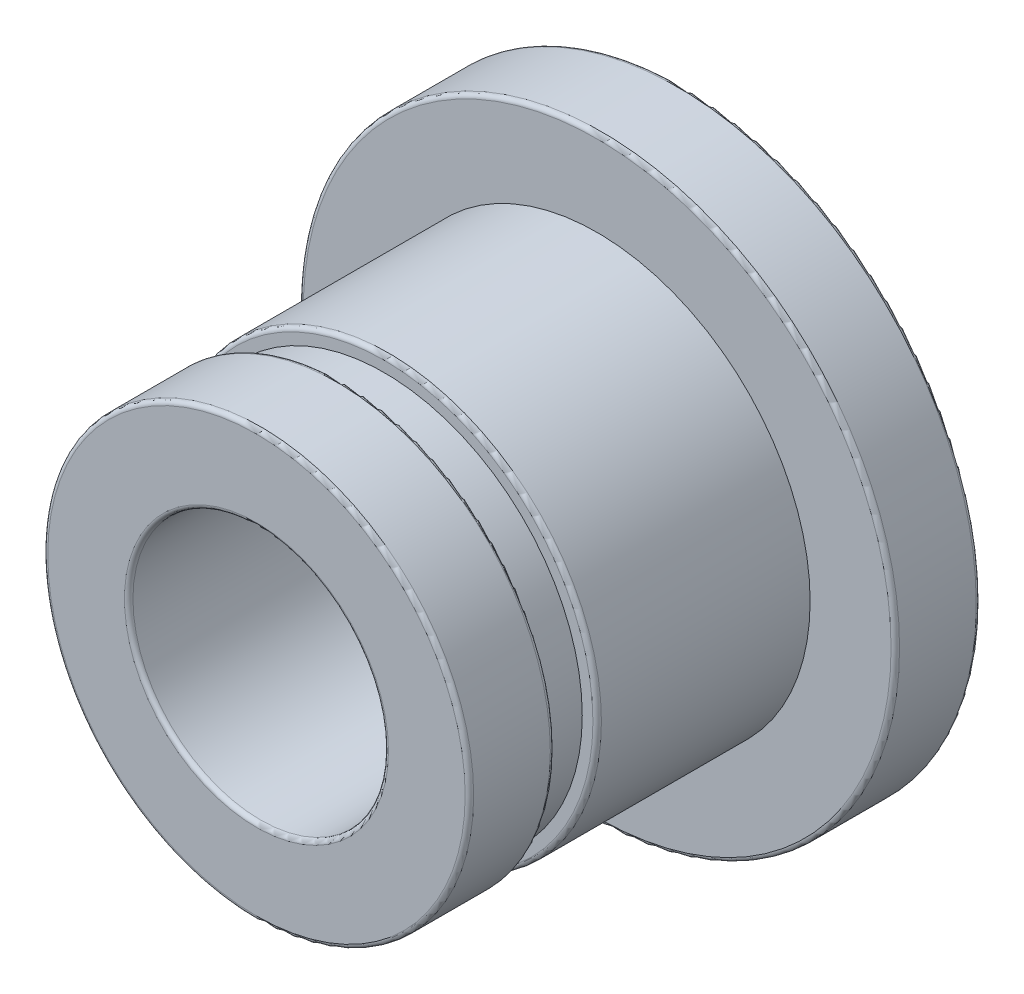
ISO-10303-21;
HEADER;
FILE_DESCRIPTION(('STEP AP214'),'2;1');
FILE_NAME('part.step','',(''),(''),'','','');
FILE_SCHEMA(('AUTOMOTIVE_DESIGN { 1 0 10303 214 1 1 1 1 }'));
ENDSEC;
DATA;
#1=APPLICATION_CONTEXT('core data for automotive mechanical design processes');
#2=APPLICATION_PROTOCOL_DEFINITION('international standard','automotive_design',2000,#1);
#3=PRODUCT_CONTEXT('',#1,'mechanical');
#4=PRODUCT('Part','Part','',(#3));
#5=PRODUCT_RELATED_PRODUCT_CATEGORY('part','',(#4));
#6=PRODUCT_DEFINITION_FORMATION('','',#4);
#7=PRODUCT_DEFINITION_CONTEXT('part definition',#1,'design');
#8=PRODUCT_DEFINITION('design','',#6,#7);
#9=PRODUCT_DEFINITION_SHAPE('','',#8);
#10=(LENGTH_UNIT() NAMED_UNIT(*) SI_UNIT(.MILLI.,.METRE.));
#11=(NAMED_UNIT(*) PLANE_ANGLE_UNIT() SI_UNIT($,.RADIAN.));
#12=(NAMED_UNIT(*) SI_UNIT($,.STERADIAN.) SOLID_ANGLE_UNIT());
#13=UNCERTAINTY_MEASURE_WITH_UNIT(LENGTH_MEASURE(1.E-05),#10,'distance_accuracy_value','');
#14=(GEOMETRIC_REPRESENTATION_CONTEXT(3) GLOBAL_UNCERTAINTY_ASSIGNED_CONTEXT((#13)) GLOBAL_UNIT_ASSIGNED_CONTEXT((#10,
#11,#12)) REPRESENTATION_CONTEXT('',''));
#15=CARTESIAN_POINT('',(0.,0.,0.));
#16=DIRECTION('',(0.,0.,1.));
#17=DIRECTION('',(1.,0.,0.));
#18=AXIS2_PLACEMENT_3D('',#15,#16,#17);
#19=CARTESIAN_POINT('',(0.,0.,10.));
#20=DIRECTION('',(0.,0.,-1.));
#21=DIRECTION('',(-1.,0.,0.));
#22=AXIS2_PLACEMENT_3D('',#19,#20,#21);
#23=CYLINDRICAL_SURFACE('',#22,5.);
#24=CARTESIAN_POINT('',(0.,0.,6.9));
#25=DIRECTION('',(0.,0.,1.));
#26=DIRECTION('',(1.,0.,0.));
#27=AXIS2_PLACEMENT_3D('',#24,#25,#26);
#28=CIRCLE('',#27,5.);
#29=CARTESIAN_POINT('',(5.,0.,6.9));
#30=VERTEX_POINT('',#29);
#31=EDGE_CURVE('E60',#30,#30,#28,.F.);
#32=ORIENTED_EDGE('',*,*,#31,.T.);
#33=EDGE_LOOP('',(#32));
#34=FACE_BOUND('',#33,.T.);
#35=CARTESIAN_POINT('',(0.,0.,2.));
#36=DIRECTION('',(0.,0.,1.));
#37=DIRECTION('',(1.,0.,0.));
#38=AXIS2_PLACEMENT_3D('',#35,#36,#37);
#39=CIRCLE('',#38,5.);
#40=CARTESIAN_POINT('',(5.,0.,2.));
#41=VERTEX_POINT('',#40);
#42=EDGE_CURVE('E75',#41,#41,#39,.T.);
#43=ORIENTED_EDGE('',*,*,#42,.T.);
#44=EDGE_LOOP('',(#43));
#45=FACE_BOUND('',#44,.T.);
#46=ADVANCED_FACE('F25',(#34,#45),#23,.T.);
#47=CARTESIAN_POINT('',(0.,0.,2.));
#48=DIRECTION('',(0.,0.,1.));
#49=DIRECTION('',(1.,0.,0.));
#50=AXIS2_PLACEMENT_3D('',#47,#48,#49);
#51=PLANE('',#50);
#52=CARTESIAN_POINT('',(0.,0.,2.));
#53=DIRECTION('',(0.,0.,1.));
#54=DIRECTION('',(1.,0.,0.));
#55=AXIS2_PLACEMENT_3D('',#52,#53,#54);
#56=CIRCLE('',#55,6.9);
#57=CARTESIAN_POINT('',(6.9,0.,2.));
#58=VERTEX_POINT('',#57);
#59=EDGE_CURVE('E45',#58,#58,#56,.T.);
#60=ORIENTED_EDGE('',*,*,#59,.T.);
#61=EDGE_LOOP('',(#60));
#62=FACE_BOUND('',#61,.T.);
#63=ORIENTED_EDGE('',*,*,#42,.F.);
#64=EDGE_LOOP('',(#63));
#65=FACE_BOUND('',#64,.T.);
#66=ADVANCED_FACE('F103',(#62,#65),#51,.T.);
#67=CARTESIAN_POINT('',(0.,0.,2.));
#68=DIRECTION('',(0.,0.,-1.));
#69=DIRECTION('',(-1.,0.,0.));
#70=AXIS2_PLACEMENT_3D('',#67,#68,#69);
#71=CYLINDRICAL_SURFACE('',#70,7.);
#72=CARTESIAN_POINT('',(0.,0.,0.1));
#73=DIRECTION('',(0.,0.,1.));
#74=DIRECTION('',(1.,0.,0.));
#75=AXIS2_PLACEMENT_3D('',#72,#73,#74);
#76=CIRCLE('',#75,7.);
#77=CARTESIAN_POINT('',(7.,0.,0.1));
#78=VERTEX_POINT('',#77);
#79=EDGE_CURVE('E54',#78,#78,#76,.T.);
#80=ORIENTED_EDGE('',*,*,#79,.T.);
#81=EDGE_LOOP('',(#80));
#82=FACE_BOUND('',#81,.T.);
#83=CARTESIAN_POINT('',(0.,0.,1.9));
#84=DIRECTION('',(0.,0.,1.));
#85=DIRECTION('',(1.,0.,0.));
#86=AXIS2_PLACEMENT_3D('',#83,#84,#85);
#87=CIRCLE('',#86,7.);
#88=CARTESIAN_POINT('',(7.,0.,1.9));
#89=VERTEX_POINT('',#88);
#90=EDGE_CURVE('E57',#89,#89,#87,.F.);
#91=ORIENTED_EDGE('',*,*,#90,.T.);
#92=EDGE_LOOP('',(#91));
#93=FACE_BOUND('',#92,.T.);
#94=ADVANCED_FACE('F27',(#82,#93),#71,.T.);
#95=CARTESIAN_POINT('',(0.,0.,0.));
#96=DIRECTION('',(0.,0.,1.));
#97=DIRECTION('',(1.,0.,0.));
#98=AXIS2_PLACEMENT_3D('',#95,#96,#97);
#99=PLANE('',#98);
#100=CARTESIAN_POINT('',(0.,0.,0.));
#101=DIRECTION('',(0.,0.,1.));
#102=DIRECTION('',(1.,0.,0.));
#103=AXIS2_PLACEMENT_3D('',#100,#101,#102);
#104=CIRCLE('',#103,6.9);
#105=CARTESIAN_POINT('',(6.9,0.,0.));
#106=VERTEX_POINT('',#105);
#107=EDGE_CURVE('E48',#106,#106,#104,.F.);
#108=ORIENTED_EDGE('',*,*,#107,.T.);
#109=EDGE_LOOP('',(#108));
#110=FACE_BOUND('',#109,.T.);
#111=CARTESIAN_POINT('',(0.,0.,0.));
#112=DIRECTION('',(0.,0.,1.));
#113=DIRECTION('',(1.,0.,0.));
#114=AXIS2_PLACEMENT_3D('',#111,#112,#113);
#115=CIRCLE('',#114,3.1);
#116=CARTESIAN_POINT('',(3.1,0.,0.));
#117=VERTEX_POINT('',#116);
#118=EDGE_CURVE('E51',#117,#117,#115,.T.);
#119=ORIENTED_EDGE('',*,*,#118,.T.);
#120=EDGE_LOOP('',(#119));
#121=FACE_BOUND('',#120,.T.);
#122=ADVANCED_FACE('F116',(#110,#121),#99,.F.);
#123=CARTESIAN_POINT('',(0.,0.,8.1));
#124=DIRECTION('',(0.,0.,1.));
#125=DIRECTION('',(1.,0.,0.));
#126=AXIS2_PLACEMENT_3D('',#123,#124,#125);
#127=CIRCLE('',#126,5.);
#128=CARTESIAN_POINT('',(5.,0.,8.1));
#129=VERTEX_POINT('',#128);
#130=EDGE_CURVE('E69',#129,#129,#127,.T.);
#131=ORIENTED_EDGE('',*,*,#130,.T.);
#132=EDGE_LOOP('',(#131));
#133=FACE_BOUND('',#132,.T.);
#134=CARTESIAN_POINT('',(0.,0.,9.9));
#135=DIRECTION('',(0.,0.,1.));
#136=DIRECTION('',(1.,0.,0.));
#137=AXIS2_PLACEMENT_3D('',#134,#135,#136);
#138=CIRCLE('',#137,5.);
#139=CARTESIAN_POINT('',(5.,0.,9.9));
#140=VERTEX_POINT('',#139);
#141=EDGE_CURVE('E72',#140,#140,#138,.F.);
#142=ORIENTED_EDGE('',*,*,#141,.T.);
#143=EDGE_LOOP('',(#142));
#144=FACE_BOUND('',#143,.T.);
#145=ADVANCED_FACE('F106',(#133,#144),#23,.T.);
#146=CARTESIAN_POINT('',(0.,0.,10.));
#147=DIRECTION('',(0.,0.,1.));
#148=DIRECTION('',(1.,0.,0.));
#149=AXIS2_PLACEMENT_3D('',#146,#147,#148);
#150=PLANE('',#149);
#151=CARTESIAN_POINT('',(0.,0.,10.));
#152=DIRECTION('',(0.,0.,1.));
#153=DIRECTION('',(1.,0.,0.));
#154=AXIS2_PLACEMENT_3D('',#151,#152,#153);
#155=CIRCLE('',#154,4.9);
#156=CARTESIAN_POINT('',(4.9,0.,10.));
#157=VERTEX_POINT('',#156);
#158=EDGE_CURVE('E36',#157,#157,#155,.T.);
#159=ORIENTED_EDGE('',*,*,#158,.T.);
#160=EDGE_LOOP('',(#159));
#161=FACE_BOUND('',#160,.T.);
#162=CARTESIAN_POINT('',(0.,0.,10.));
#163=DIRECTION('',(0.,0.,1.));
#164=DIRECTION('',(1.,0.,0.));
#165=AXIS2_PLACEMENT_3D('',#162,#163,#164);
#166=CIRCLE('',#165,3.1);
#167=CARTESIAN_POINT('',(3.1,0.,10.));
#168=VERTEX_POINT('',#167);
#169=EDGE_CURVE('E40',#168,#168,#166,.F.);
#170=ORIENTED_EDGE('',*,*,#169,.T.);
#171=EDGE_LOOP('',(#170));
#172=FACE_BOUND('',#171,.T.);
#173=ADVANCED_FACE('F115',(#161,#172),#150,.T.);
#174=CARTESIAN_POINT('',(0.,0.,0.));
#175=DIRECTION('',(0.,0.,1.));
#176=DIRECTION('',(1.,0.,0.));
#177=AXIS2_PLACEMENT_3D('',#174,#175,#176);
#178=CYLINDRICAL_SURFACE('',#177,3.);
#179=CARTESIAN_POINT('',(0.,0.,9.9));
#180=DIRECTION('',(0.,0.,1.));
#181=DIRECTION('',(1.,0.,0.));
#182=AXIS2_PLACEMENT_3D('',#179,#180,#181);
#183=CIRCLE('',#182,3.);
#184=CARTESIAN_POINT('',(3.,0.,9.9));
#185=VERTEX_POINT('',#184);
#186=EDGE_CURVE('E10',#185,#185,#183,.T.);
#187=ORIENTED_EDGE('',*,*,#186,.T.);
#188=EDGE_LOOP('',(#187));
#189=FACE_BOUND('',#188,.T.);
#190=CARTESIAN_POINT('',(0.,0.,0.1));
#191=DIRECTION('',(0.,0.,1.));
#192=DIRECTION('',(1.,0.,0.));
#193=AXIS2_PLACEMENT_3D('',#190,#191,#192);
#194=CIRCLE('',#193,3.);
#195=CARTESIAN_POINT('',(3.,0.,0.1));
#196=VERTEX_POINT('',#195);
#197=EDGE_CURVE('E32',#196,#196,#194,.F.);
#198=ORIENTED_EDGE('',*,*,#197,.T.);
#199=EDGE_LOOP('',(#198));
#200=FACE_BOUND('',#199,.T.);
#201=ADVANCED_FACE('F122',(#189,#200),#178,.F.);
#202=CARTESIAN_POINT('',(0.,0.,7.));
#203=DIRECTION('',(0.,0.,1.));
#204=DIRECTION('',(1.,0.,0.));
#205=AXIS2_PLACEMENT_3D('',#202,#203,#204);
#206=PLANE('',#205);
#207=CARTESIAN_POINT('',(0.,0.,7.));
#208=DIRECTION('',(0.,0.,1.));
#209=DIRECTION('',(1.,0.,0.));
#210=AXIS2_PLACEMENT_3D('',#207,#208,#209);
#211=CIRCLE('',#210,4.9);
#212=CARTESIAN_POINT('',(4.9,0.,7.));
#213=VERTEX_POINT('',#212);
#214=EDGE_CURVE('E63',#213,#213,#211,.T.);
#215=ORIENTED_EDGE('',*,*,#214,.T.);
#216=EDGE_LOOP('',(#215));
#217=FACE_BOUND('',#216,.T.);
#218=CARTESIAN_POINT('',(0.,0.,7.));
#219=DIRECTION('',(0.,0.,1.));
#220=DIRECTION('',(1.,0.,0.));
#221=AXIS2_PLACEMENT_3D('',#218,#219,#220);
#222=CIRCLE('',#221,4.65);
#223=CARTESIAN_POINT('',(4.65,0.,7.));
#224=VERTEX_POINT('',#223);
#225=EDGE_CURVE('E78',#224,#224,#222,.T.);
#226=ORIENTED_EDGE('',*,*,#225,.F.);
#227=EDGE_LOOP('',(#226));
#228=FACE_BOUND('',#227,.T.);
#229=ADVANCED_FACE('F100',(#217,#228),#206,.T.);
#230=CARTESIAN_POINT('',(0.,0.,8.));
#231=DIRECTION('',(0.,0.,1.));
#232=DIRECTION('',(1.,0.,0.));
#233=AXIS2_PLACEMENT_3D('',#230,#231,#232);
#234=PLANE('',#233);
#235=CARTESIAN_POINT('',(0.,0.,8.));
#236=DIRECTION('',(0.,0.,1.));
#237=DIRECTION('',(1.,0.,0.));
#238=AXIS2_PLACEMENT_3D('',#235,#236,#237);
#239=CIRCLE('',#238,4.9);
#240=CARTESIAN_POINT('',(4.9,0.,8.));
#241=VERTEX_POINT('',#240);
#242=EDGE_CURVE('E66',#241,#241,#239,.F.);
#243=ORIENTED_EDGE('',*,*,#242,.T.);
#244=EDGE_LOOP('',(#243));
#245=FACE_BOUND('',#244,.T.);
#246=CARTESIAN_POINT('',(0.,0.,8.));
#247=DIRECTION('',(0.,0.,1.));
#248=DIRECTION('',(1.,0.,0.));
#249=AXIS2_PLACEMENT_3D('',#246,#247,#248);
#250=CIRCLE('',#249,4.65);
#251=CARTESIAN_POINT('',(4.65,0.,8.));
#252=VERTEX_POINT('',#251);
#253=EDGE_CURVE('E81',#252,#252,#250,.T.);
#254=ORIENTED_EDGE('',*,*,#253,.T.);
#255=EDGE_LOOP('',(#254));
#256=FACE_BOUND('',#255,.T.);
#257=ADVANCED_FACE('F85',(#245,#256),#234,.F.);
#258=CARTESIAN_POINT('',(0.,0.,7.));
#259=DIRECTION('',(0.,0.,1.));
#260=DIRECTION('',(1.,0.,0.));
#261=AXIS2_PLACEMENT_3D('',#258,#259,#260);
#262=CYLINDRICAL_SURFACE('',#261,4.65);
#263=ORIENTED_EDGE('',*,*,#225,.T.);
#264=EDGE_LOOP('',(#263));
#265=FACE_BOUND('',#264,.T.);
#266=ORIENTED_EDGE('',*,*,#253,.F.);
#267=EDGE_LOOP('',(#266));
#268=FACE_BOUND('',#267,.T.);
#269=ADVANCED_FACE('F87',(#265,#268),#262,.T.);
#270=CARTESIAN_POINT('',(0.,0.,8.1));
#271=DIRECTION('',(0.,0.,1.));
#272=DIRECTION('',(1.,0.,0.));
#273=AXIS2_PLACEMENT_3D('',#270,#271,#272);
#274=TOROIDAL_SURFACE('',#273,4.9,0.1);
#275=ORIENTED_EDGE('',*,*,#242,.F.);
#276=EDGE_LOOP('',(#275));
#277=FACE_BOUND('',#276,.T.);
#278=ORIENTED_EDGE('',*,*,#130,.F.);
#279=EDGE_LOOP('',(#278));
#280=FACE_BOUND('',#279,.T.);
#281=ADVANCED_FACE('F89',(#277,#280),#274,.T.);
#282=CARTESIAN_POINT('',(0.,0.,6.9));
#283=DIRECTION('',(0.,0.,1.));
#284=DIRECTION('',(1.,0.,0.));
#285=AXIS2_PLACEMENT_3D('',#282,#283,#284);
#286=TOROIDAL_SURFACE('',#285,4.9,0.1);
#287=ORIENTED_EDGE('',*,*,#31,.F.);
#288=EDGE_LOOP('',(#287));
#289=FACE_BOUND('',#288,.T.);
#290=ORIENTED_EDGE('',*,*,#214,.F.);
#291=EDGE_LOOP('',(#290));
#292=FACE_BOUND('',#291,.T.);
#293=ADVANCED_FACE('F96',(#289,#292),#286,.T.);
#294=CARTESIAN_POINT('',(0.,0.,0.1));
#295=DIRECTION('',(0.,0.,1.));
#296=DIRECTION('',(1.,0.,0.));
#297=AXIS2_PLACEMENT_3D('',#294,#295,#296);
#298=TOROIDAL_SURFACE('',#297,6.9,0.1);
#299=ORIENTED_EDGE('',*,*,#107,.F.);
#300=EDGE_LOOP('',(#299));
#301=FACE_BOUND('',#300,.T.);
#302=ORIENTED_EDGE('',*,*,#79,.F.);
#303=EDGE_LOOP('',(#302));
#304=FACE_BOUND('',#303,.T.);
#305=ADVANCED_FACE('F151',(#301,#304),#298,.T.);
#306=CARTESIAN_POINT('',(0.,0.,1.9));
#307=DIRECTION('',(0.,0.,1.));
#308=DIRECTION('',(1.,0.,0.));
#309=AXIS2_PLACEMENT_3D('',#306,#307,#308);
#310=TOROIDAL_SURFACE('',#309,6.9,0.1);
#311=ORIENTED_EDGE('',*,*,#90,.F.);
#312=EDGE_LOOP('',(#311));
#313=FACE_BOUND('',#312,.T.);
#314=ORIENTED_EDGE('',*,*,#59,.F.);
#315=EDGE_LOOP('',(#314));
#316=FACE_BOUND('',#315,.T.);
#317=ADVANCED_FACE('F133',(#313,#316),#310,.T.);
#318=CARTESIAN_POINT('',(0.,0.,9.9));
#319=DIRECTION('',(0.,0.,1.));
#320=DIRECTION('',(1.,0.,0.));
#321=AXIS2_PLACEMENT_3D('',#318,#319,#320);
#322=TOROIDAL_SURFACE('',#321,4.9,0.1);
#323=ORIENTED_EDGE('',*,*,#141,.F.);
#324=EDGE_LOOP('',(#323));
#325=FACE_BOUND('',#324,.T.);
#326=ORIENTED_EDGE('',*,*,#158,.F.);
#327=EDGE_LOOP('',(#326));
#328=FACE_BOUND('',#327,.T.);
#329=ADVANCED_FACE('F129',(#325,#328),#322,.T.);
#330=CARTESIAN_POINT('',(0.,0.,9.9));
#331=DIRECTION('',(0.,0.,1.));
#332=DIRECTION('',(1.,0.,0.));
#333=AXIS2_PLACEMENT_3D('',#330,#331,#332);
#334=TOROIDAL_SURFACE('',#333,3.1,0.1);
#335=ORIENTED_EDGE('',*,*,#169,.F.);
#336=EDGE_LOOP('',(#335));
#337=FACE_BOUND('',#336,.T.);
#338=ORIENTED_EDGE('',*,*,#186,.F.);
#339=EDGE_LOOP('',(#338));
#340=FACE_BOUND('',#339,.T.);
#341=ADVANCED_FACE('F132',(#337,#340),#334,.T.);
#342=CARTESIAN_POINT('',(0.,0.,0.1));
#343=DIRECTION('',(0.,0.,1.));
#344=DIRECTION('',(1.,0.,0.));
#345=AXIS2_PLACEMENT_3D('',#342,#343,#344);
#346=TOROIDAL_SURFACE('',#345,3.1,0.1);
#347=ORIENTED_EDGE('',*,*,#197,.F.);
#348=EDGE_LOOP('',(#347));
#349=FACE_BOUND('',#348,.T.);
#350=ORIENTED_EDGE('',*,*,#118,.F.);
#351=EDGE_LOOP('',(#350));
#352=FACE_BOUND('',#351,.T.);
#353=ADVANCED_FACE('F141',(#349,#352),#346,.T.);
#354=CLOSED_SHELL('',(#46,#66,#94,#122,#145,#173,#201,#229,#257,#269,#281,#293,#305,#317,#329,
#341,#353));
#355=MANIFOLD_SOLID_BREP('B2',#354);
#356=ADVANCED_BREP_SHAPE_REPRESENTATION('',(#18,#355),#14);
#357=SHAPE_DEFINITION_REPRESENTATION(#9,#356);
ENDSEC;
END-ISO-10303-21;
